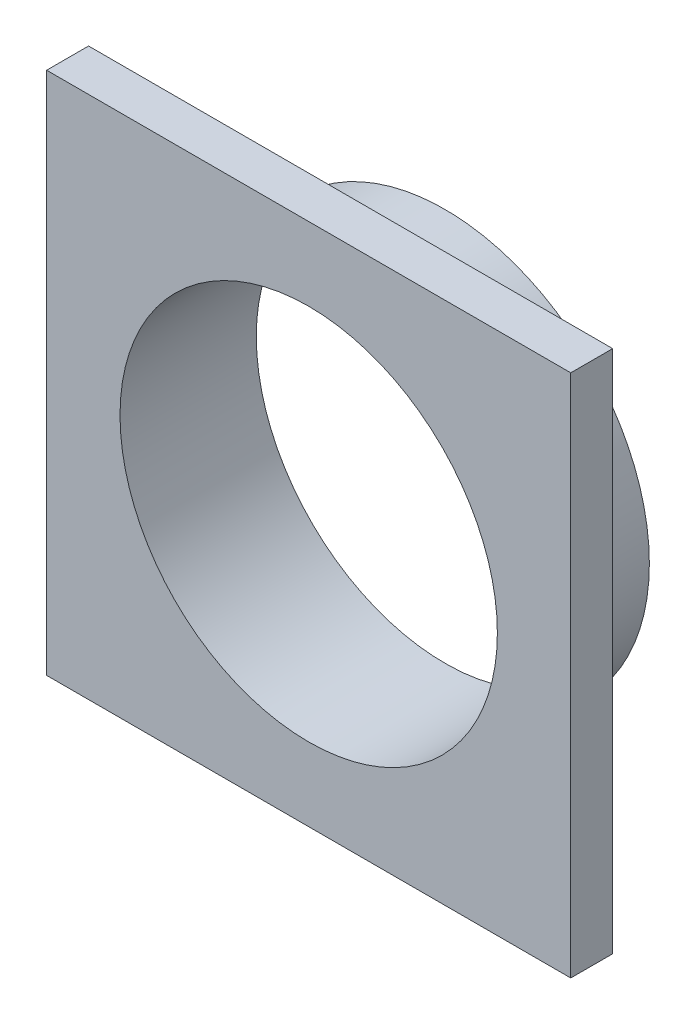
ISO-10303-21;
HEADER;
FILE_DESCRIPTION(('STEP AP214'),'2;1');
FILE_NAME('part.step','',(''),(''),'','','');
FILE_SCHEMA(('AUTOMOTIVE_DESIGN { 1 0 10303 214 1 1 1 1 }'));
ENDSEC;
DATA;
#1=APPLICATION_CONTEXT('core data for automotive mechanical design processes');
#2=APPLICATION_PROTOCOL_DEFINITION('international standard','automotive_design',2000,#1);
#3=PRODUCT_CONTEXT('',#1,'mechanical');
#4=PRODUCT('Part','Part','',(#3));
#5=PRODUCT_RELATED_PRODUCT_CATEGORY('part','',(#4));
#6=PRODUCT_DEFINITION_FORMATION('','',#4);
#7=PRODUCT_DEFINITION_CONTEXT('part definition',#1,'design');
#8=PRODUCT_DEFINITION('design','',#6,#7);
#9=PRODUCT_DEFINITION_SHAPE('','',#8);
#10=(LENGTH_UNIT() NAMED_UNIT(*) SI_UNIT(.MILLI.,.METRE.));
#11=(NAMED_UNIT(*) PLANE_ANGLE_UNIT() SI_UNIT($,.RADIAN.));
#12=(NAMED_UNIT(*) SI_UNIT($,.STERADIAN.) SOLID_ANGLE_UNIT());
#13=UNCERTAINTY_MEASURE_WITH_UNIT(LENGTH_MEASURE(1.E-05),#10,'distance_accuracy_value','');
#14=(GEOMETRIC_REPRESENTATION_CONTEXT(3) GLOBAL_UNCERTAINTY_ASSIGNED_CONTEXT((#13)) GLOBAL_UNIT_ASSIGNED_CONTEXT((#10,
#11,#12)) REPRESENTATION_CONTEXT('',''));
#15=CARTESIAN_POINT('',(0.,0.,0.));
#16=DIRECTION('',(0.,0.,1.));
#17=DIRECTION('',(1.,0.,0.));
#18=AXIS2_PLACEMENT_3D('',#15,#16,#17);
#19=CARTESIAN_POINT('',(32.2,-33.1,-30.8553390593274));
#20=DIRECTION('',(0.,0.,1.));
#21=DIRECTION('',(1.,0.,0.));
#22=AXIS2_PLACEMENT_3D('',#19,#20,#21);
#23=CYLINDRICAL_SURFACE('',#22,9.75);
#24=CARTESIAN_POINT('',(32.2,-33.1,4.5));
#25=DIRECTION('',(0.,0.,1.));
#26=DIRECTION('',(1.,0.,0.));
#27=AXIS2_PLACEMENT_3D('',#24,#25,#26);
#28=CIRCLE('',#27,9.75);
#29=CARTESIAN_POINT('',(41.95,-33.1,4.5));
#30=VERTEX_POINT('',#29);
#31=EDGE_CURVE('E11',#30,#30,#28,.F.);
#32=ORIENTED_EDGE('',*,*,#31,.F.);
#33=EDGE_LOOP('',(#32));
#34=FACE_BOUND('',#33,.T.);
#35=CARTESIAN_POINT('',(32.2,-33.1,9.));
#36=DIRECTION('',(0.,0.,1.));
#37=DIRECTION('',(1.,0.,0.));
#38=AXIS2_PLACEMENT_3D('',#35,#36,#37);
#39=CIRCLE('',#38,9.75);
#40=CARTESIAN_POINT('',(41.95,-33.1,9.));
#41=VERTEX_POINT('',#40);
#42=EDGE_CURVE('E45',#41,#41,#39,.F.);
#43=ORIENTED_EDGE('',*,*,#42,.T.);
#44=EDGE_LOOP('',(#43));
#45=FACE_BOUND('',#44,.T.);
#46=ADVANCED_FACE('F35',(#34,#45),#23,.T.);
#47=CARTESIAN_POINT('',(0.,0.,4.5));
#48=DIRECTION('',(0.,0.,1.));
#49=DIRECTION('',(1.,0.,0.));
#50=AXIS2_PLACEMENT_3D('',#47,#48,#49);
#51=PLANE('',#50);
#52=CARTESIAN_POINT('',(32.2,-33.1,4.5));
#53=DIRECTION('',(0.,0.,-1.));
#54=DIRECTION('',(-1.,0.,0.));
#55=AXIS2_PLACEMENT_3D('',#52,#53,#54);
#56=CIRCLE('',#55,9.);
#57=CARTESIAN_POINT('',(23.2,-33.1,4.5));
#58=VERTEX_POINT('',#57);
#59=EDGE_CURVE('E157',#58,#58,#56,.T.);
#60=ORIENTED_EDGE('',*,*,#59,.F.);
#61=EDGE_LOOP('',(#60));
#62=FACE_BOUND('',#61,.T.);
#63=ORIENTED_EDGE('',*,*,#31,.T.);
#64=EDGE_LOOP('',(#63));
#65=FACE_BOUND('',#64,.T.);
#66=ADVANCED_FACE('F121',(#62,#65),#51,.F.);
#67=CARTESIAN_POINT('',(0.,0.,9.));
#68=DIRECTION('',(0.,0.,1.));
#69=DIRECTION('',(1.,0.,0.));
#70=AXIS2_PLACEMENT_3D('',#67,#68,#69);
#71=PLANE('',#70);
#72=ORIENTED_EDGE('',*,*,#42,.F.);
#73=EDGE_LOOP('',(#72));
#74=FACE_BOUND('',#73,.T.);
#75=DIRECTION('',(0.,1.,0.));
#76=VECTOR('',#75,1.);
#77=CARTESIAN_POINT('',(44.7,-20.6,9.));
#78=LINE('',#77,#76);
#79=CARTESIAN_POINT('',(44.7,-45.6,9.));
#80=VERTEX_POINT('',#79);
#81=CARTESIAN_POINT('',(44.7,-20.6,9.));
#82=VERTEX_POINT('',#81);
#83=EDGE_CURVE('E99',#80,#82,#78,.T.);
#84=ORIENTED_EDGE('',*,*,#83,.F.);
#85=DIRECTION('',(1.,0.,0.));
#86=VECTOR('',#85,1.);
#87=CARTESIAN_POINT('',(19.7,-45.6,9.));
#88=LINE('',#87,#86);
#89=CARTESIAN_POINT('',(19.7,-45.6,9.));
#90=VERTEX_POINT('',#89);
#91=EDGE_CURVE('E96',#90,#80,#88,.T.);
#92=ORIENTED_EDGE('',*,*,#91,.F.);
#93=DIRECTION('',(0.,-1.,0.));
#94=VECTOR('',#93,1.);
#95=CARTESIAN_POINT('',(19.7,-20.6,9.));
#96=LINE('',#95,#94);
#97=CARTESIAN_POINT('',(19.7,-20.6,9.));
#98=VERTEX_POINT('',#97);
#99=EDGE_CURVE('E88',#98,#90,#96,.T.);
#100=ORIENTED_EDGE('',*,*,#99,.F.);
#101=DIRECTION('',(-1.,0.,0.));
#102=VECTOR('',#101,1.);
#103=CARTESIAN_POINT('',(19.7,-20.6,9.));
#104=LINE('',#103,#102);
#105=EDGE_CURVE('E95',#82,#98,#104,.T.);
#106=ORIENTED_EDGE('',*,*,#105,.F.);
#107=EDGE_LOOP('',(#84,#92,#100,#106));
#108=FACE_BOUND('',#107,.T.);
#109=ADVANCED_FACE('F94',(#74,#108),#71,.F.);
#110=CARTESIAN_POINT('',(19.7,-20.6,9.));
#111=DIRECTION('',(0.,1.,0.));
#112=DIRECTION('',(0.,0.,1.));
#113=AXIS2_PLACEMENT_3D('',#110,#111,#112);
#114=PLANE('',#113);
#115=DIRECTION('',(-1.,0.,0.));
#116=VECTOR('',#115,1.);
#117=CARTESIAN_POINT('',(19.7,-20.6,11.));
#118=LINE('',#117,#116);
#119=CARTESIAN_POINT('',(44.7,-20.6,11.));
#120=VERTEX_POINT('',#119);
#121=CARTESIAN_POINT('',(19.7,-20.6,11.));
#122=VERTEX_POINT('',#121);
#123=EDGE_CURVE('E109',#120,#122,#118,.T.);
#124=ORIENTED_EDGE('',*,*,#123,.F.);
#125=DIRECTION('',(0.,0.,1.));
#126=VECTOR('',#125,1.);
#127=CARTESIAN_POINT('',(44.7,-20.6,9.));
#128=LINE('',#127,#126);
#129=EDGE_CURVE('E82',#82,#120,#128,.T.);
#130=ORIENTED_EDGE('',*,*,#129,.F.);
#131=ORIENTED_EDGE('',*,*,#105,.T.);
#132=DIRECTION('',(0.,0.,1.));
#133=VECTOR('',#132,1.);
#134=CARTESIAN_POINT('',(19.7,-20.6,9.));
#135=LINE('',#134,#133);
#136=EDGE_CURVE('E85',#98,#122,#135,.T.);
#137=ORIENTED_EDGE('',*,*,#136,.T.);
#138=EDGE_LOOP('',(#124,#130,#131,#137));
#139=FACE_BOUND('',#138,.T.);
#140=ADVANCED_FACE('F98',(#139),#114,.T.);
#141=CARTESIAN_POINT('',(19.7,-20.6,9.));
#142=DIRECTION('',(-1.,0.,0.));
#143=DIRECTION('',(0.,-1.,0.));
#144=AXIS2_PLACEMENT_3D('',#141,#142,#143);
#145=PLANE('',#144);
#146=DIRECTION('',(0.,-1.,0.));
#147=VECTOR('',#146,1.);
#148=CARTESIAN_POINT('',(19.7,-20.6,11.));
#149=LINE('',#148,#147);
#150=CARTESIAN_POINT('',(19.7,-45.6,11.));
#151=VERTEX_POINT('',#150);
#152=EDGE_CURVE('E90',#122,#151,#149,.T.);
#153=ORIENTED_EDGE('',*,*,#152,.F.);
#154=ORIENTED_EDGE('',*,*,#136,.F.);
#155=ORIENTED_EDGE('',*,*,#99,.T.);
#156=DIRECTION('',(0.,0.,1.));
#157=VECTOR('',#156,1.);
#158=CARTESIAN_POINT('',(19.7,-45.6,9.));
#159=LINE('',#158,#157);
#160=EDGE_CURVE('E71',#90,#151,#159,.T.);
#161=ORIENTED_EDGE('',*,*,#160,.T.);
#162=EDGE_LOOP('',(#153,#154,#155,#161));
#163=FACE_BOUND('',#162,.T.);
#164=ADVANCED_FACE('F87',(#163),#145,.T.);
#165=CARTESIAN_POINT('',(19.7,-45.6,9.));
#166=DIRECTION('',(0.,-1.,0.));
#167=DIRECTION('',(0.,0.,-1.));
#168=AXIS2_PLACEMENT_3D('',#165,#166,#167);
#169=PLANE('',#168);
#170=DIRECTION('',(1.,0.,0.));
#171=VECTOR('',#170,1.);
#172=CARTESIAN_POINT('',(19.7,-45.6,11.));
#173=LINE('',#172,#171);
#174=CARTESIAN_POINT('',(44.7,-45.6,11.));
#175=VERTEX_POINT('',#174);
#176=EDGE_CURVE('E101',#151,#175,#173,.T.);
#177=ORIENTED_EDGE('',*,*,#176,.F.);
#178=ORIENTED_EDGE('',*,*,#160,.F.);
#179=ORIENTED_EDGE('',*,*,#91,.T.);
#180=DIRECTION('',(0.,0.,1.));
#181=VECTOR('',#180,1.);
#182=CARTESIAN_POINT('',(44.7,-45.6,9.));
#183=LINE('',#182,#181);
#184=EDGE_CURVE('E54',#80,#175,#183,.T.);
#185=ORIENTED_EDGE('',*,*,#184,.T.);
#186=EDGE_LOOP('',(#177,#178,#179,#185));
#187=FACE_BOUND('',#186,.T.);
#188=ADVANCED_FACE('F140',(#187),#169,.T.);
#189=CARTESIAN_POINT('',(44.7,-20.6,9.));
#190=DIRECTION('',(1.,0.,0.));
#191=DIRECTION('',(0.,1.,0.));
#192=AXIS2_PLACEMENT_3D('',#189,#190,#191);
#193=PLANE('',#192);
#194=DIRECTION('',(0.,1.,0.));
#195=VECTOR('',#194,1.);
#196=CARTESIAN_POINT('',(44.7,-20.6,11.));
#197=LINE('',#196,#195);
#198=EDGE_CURVE('E106',#175,#120,#197,.T.);
#199=ORIENTED_EDGE('',*,*,#198,.F.);
#200=ORIENTED_EDGE('',*,*,#184,.F.);
#201=ORIENTED_EDGE('',*,*,#83,.T.);
#202=ORIENTED_EDGE('',*,*,#129,.T.);
#203=EDGE_LOOP('',(#199,#200,#201,#202));
#204=FACE_BOUND('',#203,.T.);
#205=ADVANCED_FACE('F138',(#204),#193,.T.);
#206=CARTESIAN_POINT('',(-29.87,-35.43,11.));
#207=DIRECTION('',(0.,0.,1.));
#208=DIRECTION('',(1.,0.,0.));
#209=AXIS2_PLACEMENT_3D('',#206,#207,#208);
#210=PLANE('',#209);
#211=CARTESIAN_POINT('',(32.2,-33.1,11.));
#212=DIRECTION('',(0.,0.,1.));
#213=DIRECTION('',(1.,0.,0.));
#214=AXIS2_PLACEMENT_3D('',#211,#212,#213);
#215=CIRCLE('',#214,9.);
#216=CARTESIAN_POINT('',(41.2,-33.1,11.));
#217=VERTEX_POINT('',#216);
#218=EDGE_CURVE('E39',#217,#217,#215,.T.);
#219=ORIENTED_EDGE('',*,*,#218,.F.);
#220=EDGE_LOOP('',(#219));
#221=FACE_BOUND('',#220,.T.);
#222=ORIENTED_EDGE('',*,*,#198,.T.);
#223=ORIENTED_EDGE('',*,*,#123,.T.);
#224=ORIENTED_EDGE('',*,*,#152,.T.);
#225=ORIENTED_EDGE('',*,*,#176,.T.);
#226=EDGE_LOOP('',(#222,#223,#224,#225));
#227=FACE_BOUND('',#226,.T.);
#228=ADVANCED_FACE('F37',(#221,#227),#210,.T.);
#229=CARTESIAN_POINT('',(32.2,-33.1,14.5));
#230=DIRECTION('',(0.,0.,-1.));
#231=DIRECTION('',(-1.,0.,0.));
#232=AXIS2_PLACEMENT_3D('',#229,#230,#231);
#233=CYLINDRICAL_SURFACE('',#232,9.);
#234=ORIENTED_EDGE('',*,*,#218,.T.);
#235=EDGE_LOOP('',(#234));
#236=FACE_BOUND('',#235,.T.);
#237=ORIENTED_EDGE('',*,*,#59,.T.);
#238=EDGE_LOOP('',(#237));
#239=FACE_BOUND('',#238,.T.);
#240=ADVANCED_FACE('F148',(#236,#239),#233,.F.);
#241=CLOSED_SHELL('',(#46,#66,#109,#140,#164,#188,#205,#228,#240));
#242=MANIFOLD_SOLID_BREP('B2',#241);
#243=ADVANCED_BREP_SHAPE_REPRESENTATION('',(#18,#242),#14);
#244=SHAPE_DEFINITION_REPRESENTATION(#9,#243);
ENDSEC;
END-ISO-10303-21;
